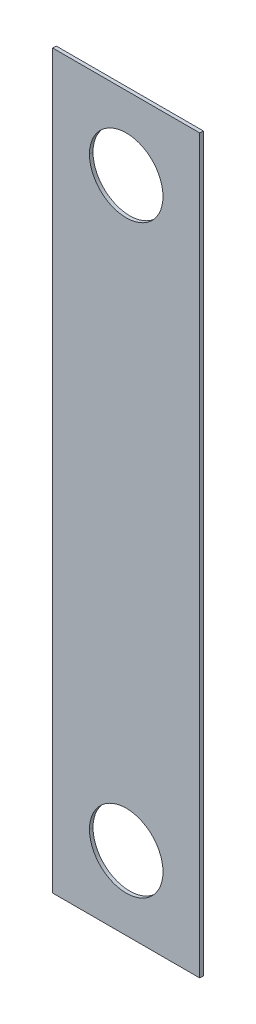
ISO-10303-21;
HEADER;
FILE_DESCRIPTION(('STEP AP214'),'2;1');
FILE_NAME('part.step','',(''),(''),'','','');
FILE_SCHEMA(('AUTOMOTIVE_DESIGN { 1 0 10303 214 1 1 1 1 }'));
ENDSEC;
DATA;
#1=APPLICATION_CONTEXT('core data for automotive mechanical design processes');
#2=APPLICATION_PROTOCOL_DEFINITION('international standard','automotive_design',2000,#1);
#3=PRODUCT_CONTEXT('',#1,'mechanical');
#4=PRODUCT('Part','Part','',(#3));
#5=PRODUCT_RELATED_PRODUCT_CATEGORY('part','',(#4));
#6=PRODUCT_DEFINITION_FORMATION('','',#4);
#7=PRODUCT_DEFINITION_CONTEXT('part definition',#1,'design');
#8=PRODUCT_DEFINITION('design','',#6,#7);
#9=PRODUCT_DEFINITION_SHAPE('','',#8);
#10=(LENGTH_UNIT() NAMED_UNIT(*) SI_UNIT(.MILLI.,.METRE.));
#11=(NAMED_UNIT(*) PLANE_ANGLE_UNIT() SI_UNIT($,.RADIAN.));
#12=(NAMED_UNIT(*) SI_UNIT($,.STERADIAN.) SOLID_ANGLE_UNIT());
#13=UNCERTAINTY_MEASURE_WITH_UNIT(LENGTH_MEASURE(1.E-05),#10,'distance_accuracy_value','');
#14=(GEOMETRIC_REPRESENTATION_CONTEXT(3) GLOBAL_UNCERTAINTY_ASSIGNED_CONTEXT((#13)) GLOBAL_UNIT_ASSIGNED_CONTEXT((#10,
#11,#12)) REPRESENTATION_CONTEXT('',''));
#15=CARTESIAN_POINT('',(0.,0.,0.));
#16=DIRECTION('',(0.,0.,1.));
#17=DIRECTION('',(1.,0.,0.));
#18=AXIS2_PLACEMENT_3D('',#15,#16,#17);
#19=CARTESIAN_POINT('',(6.35,6.35,0.3048));
#20=DIRECTION('',(0.,0.,-1.));
#21=DIRECTION('',(-1.,0.,0.));
#22=AXIS2_PLACEMENT_3D('',#19,#20,#21);
#23=CYLINDRICAL_SURFACE('',#22,3.175);
#24=DIRECTION('',(0.,0.,-1.));
#25=VECTOR('',#24,1.);
#26=CARTESIAN_POINT('',(9.525,6.35,0.3048));
#27=LINE('',#26,#25);
#28=CARTESIAN_POINT('',(9.525,6.35,0.3048));
#29=VERTEX_POINT('',#28);
#30=CARTESIAN_POINT('',(9.525,6.35,0.));
#31=VERTEX_POINT('',#30);
#32=EDGE_CURVE('E148',#29,#31,#27,.T.);
#33=ORIENTED_EDGE('',*,*,#32,.F.);
#34=CARTESIAN_POINT('',(6.35,6.35,0.3048));
#35=DIRECTION('',(0.,0.,1.));
#36=DIRECTION('',(1.,0.,0.));
#37=AXIS2_PLACEMENT_3D('',#34,#35,#36);
#38=CIRCLE('',#37,3.175);
#39=CARTESIAN_POINT('',(3.175,6.35,0.3048));
#40=VERTEX_POINT('',#39);
#41=EDGE_CURVE('E81',#29,#40,#38,.T.);
#42=ORIENTED_EDGE('',*,*,#41,.T.);
#43=DIRECTION('',(0.,0.,-1.));
#44=VECTOR('',#43,1.);
#45=CARTESIAN_POINT('',(3.175,6.35,0.3048));
#46=LINE('',#45,#44);
#47=CARTESIAN_POINT('',(3.175,6.35,0.));
#48=VERTEX_POINT('',#47);
#49=EDGE_CURVE('E156',#40,#48,#46,.T.);
#50=ORIENTED_EDGE('',*,*,#49,.T.);
#51=CARTESIAN_POINT('',(6.35,6.35,0.));
#52=DIRECTION('',(0.,0.,1.));
#53=DIRECTION('',(1.,0.,0.));
#54=AXIS2_PLACEMENT_3D('',#51,#52,#53);
#55=CIRCLE('',#54,3.175);
#56=EDGE_CURVE('E143',#31,#48,#55,.T.);
#57=ORIENTED_EDGE('',*,*,#56,.F.);
#58=EDGE_LOOP('',(#33,#42,#50,#57));
#59=FACE_BOUND('',#58,.T.);
#60=ADVANCED_FACE('F15',(#59),#23,.F.);
#61=CARTESIAN_POINT('',(6.35,56.87,0.3048));
#62=DIRECTION('',(0.,0.,-1.));
#63=DIRECTION('',(-1.,0.,0.));
#64=AXIS2_PLACEMENT_3D('',#61,#62,#63);
#65=CYLINDRICAL_SURFACE('',#64,3.175);
#66=DIRECTION('',(0.,0.,-1.));
#67=VECTOR('',#66,1.);
#68=CARTESIAN_POINT('',(9.525,56.87,0.3048));
#69=LINE('',#68,#67);
#70=CARTESIAN_POINT('',(9.525,56.87,0.3048));
#71=VERTEX_POINT('',#70);
#72=CARTESIAN_POINT('',(9.525,56.87,0.));
#73=VERTEX_POINT('',#72);
#74=EDGE_CURVE('E182',#71,#73,#69,.T.);
#75=ORIENTED_EDGE('',*,*,#74,.F.);
#76=CARTESIAN_POINT('',(6.35,56.87,0.3048));
#77=DIRECTION('',(0.,0.,1.));
#78=DIRECTION('',(1.,0.,0.));
#79=AXIS2_PLACEMENT_3D('',#76,#77,#78);
#80=CIRCLE('',#79,3.175);
#81=CARTESIAN_POINT('',(3.175,56.87,0.3048));
#82=VERTEX_POINT('',#81);
#83=EDGE_CURVE('E125',#71,#82,#80,.T.);
#84=ORIENTED_EDGE('',*,*,#83,.T.);
#85=DIRECTION('',(0.,0.,-1.));
#86=VECTOR('',#85,1.);
#87=CARTESIAN_POINT('',(3.175,56.87,0.3048));
#88=LINE('',#87,#86);
#89=CARTESIAN_POINT('',(3.175,56.87,0.));
#90=VERTEX_POINT('',#89);
#91=EDGE_CURVE('E167',#82,#90,#88,.T.);
#92=ORIENTED_EDGE('',*,*,#91,.T.);
#93=CARTESIAN_POINT('',(6.35,56.87,0.));
#94=DIRECTION('',(0.,0.,1.));
#95=DIRECTION('',(1.,0.,0.));
#96=AXIS2_PLACEMENT_3D('',#93,#94,#95);
#97=CIRCLE('',#96,3.175);
#98=EDGE_CURVE('E140',#73,#90,#97,.T.);
#99=ORIENTED_EDGE('',*,*,#98,.F.);
#100=EDGE_LOOP('',(#75,#84,#92,#99));
#101=FACE_BOUND('',#100,.T.);
#102=ADVANCED_FACE('F236',(#101),#65,.F.);
#103=CARTESIAN_POINT('',(0.,63.22,0.3048));
#104=DIRECTION('',(0.,-1.,0.));
#105=DIRECTION('',(0.,0.,-1.));
#106=AXIS2_PLACEMENT_3D('',#103,#104,#105);
#107=PLANE('',#106);
#108=DIRECTION('',(-1.,0.,0.));
#109=VECTOR('',#108,1.);
#110=CARTESIAN_POINT('',(0.,63.22,0.));
#111=LINE('',#110,#109);
#112=CARTESIAN_POINT('',(12.7,63.22,0.));
#113=VERTEX_POINT('',#112);
#114=CARTESIAN_POINT('',(0.,63.22,0.));
#115=VERTEX_POINT('',#114);
#116=EDGE_CURVE('E166',#113,#115,#111,.T.);
#117=ORIENTED_EDGE('',*,*,#116,.T.);
#118=DIRECTION('',(0.,0.,-1.));
#119=VECTOR('',#118,1.);
#120=CARTESIAN_POINT('',(0.,63.22,0.3048));
#121=LINE('',#120,#119);
#122=CARTESIAN_POINT('',(0.,63.22,0.3048));
#123=VERTEX_POINT('',#122);
#124=EDGE_CURVE('E120',#123,#115,#121,.T.);
#125=ORIENTED_EDGE('',*,*,#124,.F.);
#126=DIRECTION('',(-1.,0.,0.));
#127=VECTOR('',#126,1.);
#128=CARTESIAN_POINT('',(0.,63.22,0.3048));
#129=LINE('',#128,#127);
#130=CARTESIAN_POINT('',(12.7,63.22,0.3048));
#131=VERTEX_POINT('',#130);
#132=EDGE_CURVE('E118',#131,#123,#129,.T.);
#133=ORIENTED_EDGE('',*,*,#132,.F.);
#134=DIRECTION('',(0.,0.,-1.));
#135=VECTOR('',#134,1.);
#136=CARTESIAN_POINT('',(12.7,63.22,0.3048));
#137=LINE('',#136,#135);
#138=EDGE_CURVE('E10',#131,#113,#137,.T.);
#139=ORIENTED_EDGE('',*,*,#138,.T.);
#140=EDGE_LOOP('',(#117,#125,#133,#139));
#141=FACE_BOUND('',#140,.T.);
#142=ADVANCED_FACE('F119',(#141),#107,.F.);
#143=CARTESIAN_POINT('',(12.7,0.,0.3048));
#144=DIRECTION('',(-1.,0.,0.));
#145=DIRECTION('',(0.,1.,0.));
#146=AXIS2_PLACEMENT_3D('',#143,#144,#145);
#147=PLANE('',#146);
#148=DIRECTION('',(0.,1.,0.));
#149=VECTOR('',#148,1.);
#150=CARTESIAN_POINT('',(12.7,0.,0.));
#151=LINE('',#150,#149);
#152=CARTESIAN_POINT('',(12.7,0.,0.));
#153=VERTEX_POINT('',#152);
#154=EDGE_CURVE('E19',#153,#113,#151,.T.);
#155=ORIENTED_EDGE('',*,*,#154,.T.);
#156=ORIENTED_EDGE('',*,*,#138,.F.);
#157=DIRECTION('',(0.,1.,0.));
#158=VECTOR('',#157,1.);
#159=CARTESIAN_POINT('',(12.7,0.,0.3048));
#160=LINE('',#159,#158);
#161=CARTESIAN_POINT('',(12.7,0.,0.3048));
#162=VERTEX_POINT('',#161);
#163=EDGE_CURVE('E113',#162,#131,#160,.T.);
#164=ORIENTED_EDGE('',*,*,#163,.F.);
#165=DIRECTION('',(0.,0.,-1.));
#166=VECTOR('',#165,1.);
#167=CARTESIAN_POINT('',(12.7,0.,0.3048));
#168=LINE('',#167,#166);
#169=EDGE_CURVE('E25',#162,#153,#168,.T.);
#170=ORIENTED_EDGE('',*,*,#169,.T.);
#171=EDGE_LOOP('',(#155,#156,#164,#170));
#172=FACE_BOUND('',#171,.T.);
#173=ADVANCED_FACE('F111',(#172),#147,.F.);
#174=CARTESIAN_POINT('',(0.,0.,0.3048));
#175=DIRECTION('',(0.,1.,0.));
#176=DIRECTION('',(1.,0.,0.));
#177=AXIS2_PLACEMENT_3D('',#174,#175,#176);
#178=PLANE('',#177);
#179=DIRECTION('',(1.,0.,0.));
#180=VECTOR('',#179,1.);
#181=CARTESIAN_POINT('',(0.,0.,0.));
#182=LINE('',#181,#180);
#183=CARTESIAN_POINT('',(0.,0.,0.));
#184=VERTEX_POINT('',#183);
#185=EDGE_CURVE('E144',#184,#153,#182,.T.);
#186=ORIENTED_EDGE('',*,*,#185,.T.);
#187=ORIENTED_EDGE('',*,*,#169,.F.);
#188=DIRECTION('',(1.,0.,0.));
#189=VECTOR('',#188,1.);
#190=CARTESIAN_POINT('',(0.,0.,0.3048));
#191=LINE('',#190,#189);
#192=CARTESIAN_POINT('',(0.,0.,0.3048));
#193=VERTEX_POINT('',#192);
#194=EDGE_CURVE('E129',#193,#162,#191,.T.);
#195=ORIENTED_EDGE('',*,*,#194,.F.);
#196=DIRECTION('',(0.,0.,-1.));
#197=VECTOR('',#196,1.);
#198=CARTESIAN_POINT('',(0.,0.,0.3048));
#199=LINE('',#198,#197);
#200=EDGE_CURVE('E147',#193,#184,#199,.T.);
#201=ORIENTED_EDGE('',*,*,#200,.T.);
#202=EDGE_LOOP('',(#186,#187,#195,#201));
#203=FACE_BOUND('',#202,.T.);
#204=ADVANCED_FACE('F249',(#203),#178,.F.);
#205=CARTESIAN_POINT('',(0.,0.,0.3048));
#206=DIRECTION('',(1.,0.,0.));
#207=DIRECTION('',(0.,1.,0.));
#208=AXIS2_PLACEMENT_3D('',#205,#206,#207);
#209=PLANE('',#208);
#210=DIRECTION('',(0.,-1.,0.));
#211=VECTOR('',#210,1.);
#212=CARTESIAN_POINT('',(0.,0.,0.));
#213=LINE('',#212,#211);
#214=EDGE_CURVE('E162',#115,#184,#213,.T.);
#215=ORIENTED_EDGE('',*,*,#214,.T.);
#216=ORIENTED_EDGE('',*,*,#200,.F.);
#217=DIRECTION('',(0.,-1.,0.));
#218=VECTOR('',#217,1.);
#219=CARTESIAN_POINT('',(0.,0.,0.3048));
#220=LINE('',#219,#218);
#221=EDGE_CURVE('E136',#123,#193,#220,.T.);
#222=ORIENTED_EDGE('',*,*,#221,.F.);
#223=ORIENTED_EDGE('',*,*,#124,.T.);
#224=EDGE_LOOP('',(#215,#216,#222,#223));
#225=FACE_BOUND('',#224,.T.);
#226=ADVANCED_FACE('F254',(#225),#209,.F.);
#227=CARTESIAN_POINT('',(0.,0.,0.));
#228=DIRECTION('',(0.,0.,-1.));
#229=DIRECTION('',(0.,-1.,0.));
#230=AXIS2_PLACEMENT_3D('',#227,#228,#229);
#231=PLANE('',#230);
#232=CARTESIAN_POINT('',(6.35,6.35,0.));
#233=DIRECTION('',(0.,0.,1.));
#234=DIRECTION('',(1.,0.,0.));
#235=AXIS2_PLACEMENT_3D('',#232,#233,#234);
#236=CIRCLE('',#235,3.175);
#237=EDGE_CURVE('E152',#48,#31,#236,.T.);
#238=ORIENTED_EDGE('',*,*,#237,.T.);
#239=ORIENTED_EDGE('',*,*,#56,.T.);
#240=EDGE_LOOP('',(#238,#239));
#241=FACE_BOUND('',#240,.T.);
#242=CARTESIAN_POINT('',(6.35,56.87,0.));
#243=DIRECTION('',(0.,0.,1.));
#244=DIRECTION('',(1.,0.,0.));
#245=AXIS2_PLACEMENT_3D('',#242,#243,#244);
#246=CIRCLE('',#245,3.175);
#247=EDGE_CURVE('E171',#90,#73,#246,.T.);
#248=ORIENTED_EDGE('',*,*,#247,.T.);
#249=ORIENTED_EDGE('',*,*,#98,.T.);
#250=EDGE_LOOP('',(#248,#249));
#251=FACE_BOUND('',#250,.T.);
#252=ORIENTED_EDGE('',*,*,#214,.F.);
#253=ORIENTED_EDGE('',*,*,#116,.F.);
#254=ORIENTED_EDGE('',*,*,#154,.F.);
#255=ORIENTED_EDGE('',*,*,#185,.F.);
#256=EDGE_LOOP('',(#252,#253,#254,#255));
#257=FACE_BOUND('',#256,.T.);
#258=ADVANCED_FACE('F207',(#241,#251,#257),#231,.T.);
#259=CARTESIAN_POINT('',(0.,0.,0.3048));
#260=DIRECTION('',(0.,0.,-1.));
#261=DIRECTION('',(0.,-1.,0.));
#262=AXIS2_PLACEMENT_3D('',#259,#260,#261);
#263=PLANE('',#262);
#264=CARTESIAN_POINT('',(6.35,6.35,0.3048));
#265=DIRECTION('',(0.,0.,1.));
#266=DIRECTION('',(1.,0.,0.));
#267=AXIS2_PLACEMENT_3D('',#264,#265,#266);
#268=CIRCLE('',#267,3.175);
#269=EDGE_CURVE('E153',#40,#29,#268,.T.);
#270=ORIENTED_EDGE('',*,*,#269,.F.);
#271=ORIENTED_EDGE('',*,*,#41,.F.);
#272=EDGE_LOOP('',(#270,#271));
#273=FACE_BOUND('',#272,.T.);
#274=CARTESIAN_POINT('',(6.35,56.87,0.3048));
#275=DIRECTION('',(0.,0.,1.));
#276=DIRECTION('',(1.,0.,0.));
#277=AXIS2_PLACEMENT_3D('',#274,#275,#276);
#278=CIRCLE('',#277,3.175);
#279=EDGE_CURVE('E159',#82,#71,#278,.T.);
#280=ORIENTED_EDGE('',*,*,#279,.F.);
#281=ORIENTED_EDGE('',*,*,#83,.F.);
#282=EDGE_LOOP('',(#280,#281));
#283=FACE_BOUND('',#282,.T.);
#284=ORIENTED_EDGE('',*,*,#221,.T.);
#285=ORIENTED_EDGE('',*,*,#194,.T.);
#286=ORIENTED_EDGE('',*,*,#163,.T.);
#287=ORIENTED_EDGE('',*,*,#132,.T.);
#288=EDGE_LOOP('',(#284,#285,#286,#287));
#289=FACE_BOUND('',#288,.T.);
#290=ADVANCED_FACE('F127',(#273,#283,#289),#263,.F.);
#291=CARTESIAN_POINT('',(6.35,56.87,0.3048));
#292=DIRECTION('',(0.,0.,-1.));
#293=DIRECTION('',(-1.,0.,0.));
#294=AXIS2_PLACEMENT_3D('',#291,#292,#293);
#295=CYLINDRICAL_SURFACE('',#294,3.175);
#296=ORIENTED_EDGE('',*,*,#279,.T.);
#297=ORIENTED_EDGE('',*,*,#74,.T.);
#298=ORIENTED_EDGE('',*,*,#247,.F.);
#299=ORIENTED_EDGE('',*,*,#91,.F.);
#300=EDGE_LOOP('',(#296,#297,#298,#299));
#301=FACE_BOUND('',#300,.T.);
#302=ADVANCED_FACE('F17',(#301),#295,.F.);
#303=CARTESIAN_POINT('',(6.35,6.35,0.3048));
#304=DIRECTION('',(0.,0.,-1.));
#305=DIRECTION('',(-1.,0.,0.));
#306=AXIS2_PLACEMENT_3D('',#303,#304,#305);
#307=CYLINDRICAL_SURFACE('',#306,3.175);
#308=ORIENTED_EDGE('',*,*,#269,.T.);
#309=ORIENTED_EDGE('',*,*,#32,.T.);
#310=ORIENTED_EDGE('',*,*,#237,.F.);
#311=ORIENTED_EDGE('',*,*,#49,.F.);
#312=EDGE_LOOP('',(#308,#309,#310,#311));
#313=FACE_BOUND('',#312,.T.);
#314=ADVANCED_FACE('F203',(#313),#307,.F.);
#315=CLOSED_SHELL('',(#60,#102,#142,#173,#204,#226,#258,#290,#302,#314));
#316=MANIFOLD_SOLID_BREP('B1',#315);
#317=ADVANCED_BREP_SHAPE_REPRESENTATION('',(#18,#316),#14);
#318=SHAPE_DEFINITION_REPRESENTATION(#9,#317);
ENDSEC;
END-ISO-10303-21;
